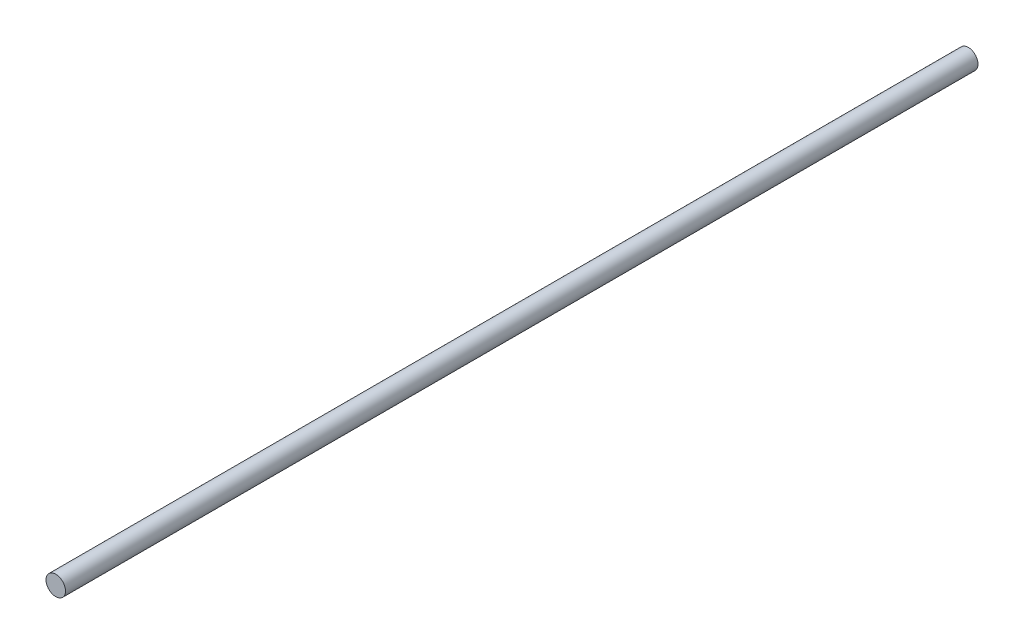
ISO-10303-21;
HEADER;
FILE_DESCRIPTION(('STEP AP214'),'2;1');
FILE_NAME('part.step','',(''),(''),'','','');
FILE_SCHEMA(('AUTOMOTIVE_DESIGN { 1 0 10303 214 1 1 1 1 }'));
ENDSEC;
DATA;
#1=APPLICATION_CONTEXT('core data for automotive mechanical design processes');
#2=APPLICATION_PROTOCOL_DEFINITION('international standard','automotive_design',2000,#1);
#3=PRODUCT_CONTEXT('',#1,'mechanical');
#4=PRODUCT('Part','Part','',(#3));
#5=PRODUCT_RELATED_PRODUCT_CATEGORY('part','',(#4));
#6=PRODUCT_DEFINITION_FORMATION('','',#4);
#7=PRODUCT_DEFINITION_CONTEXT('part definition',#1,'design');
#8=PRODUCT_DEFINITION('design','',#6,#7);
#9=PRODUCT_DEFINITION_SHAPE('','',#8);
#10=(LENGTH_UNIT() NAMED_UNIT(*) SI_UNIT(.MILLI.,.METRE.));
#11=(NAMED_UNIT(*) PLANE_ANGLE_UNIT() SI_UNIT($,.RADIAN.));
#12=(NAMED_UNIT(*) SI_UNIT($,.STERADIAN.) SOLID_ANGLE_UNIT());
#13=UNCERTAINTY_MEASURE_WITH_UNIT(LENGTH_MEASURE(1.E-05),#10,'distance_accuracy_value','');
#14=(GEOMETRIC_REPRESENTATION_CONTEXT(3) GLOBAL_UNCERTAINTY_ASSIGNED_CONTEXT((#13)) GLOBAL_UNIT_ASSIGNED_CONTEXT((#10,
#11,#12)) REPRESENTATION_CONTEXT('',''));
#15=CARTESIAN_POINT('',(0.,0.,0.));
#16=DIRECTION('',(0.,0.,1.));
#17=DIRECTION('',(1.,0.,0.));
#18=AXIS2_PLACEMENT_3D('',#15,#16,#17);
#19=CARTESIAN_POINT('',(0.,0.,374.65));
#20=DIRECTION('',(0.,0.,-1.));
#21=DIRECTION('',(-1.,0.,0.));
#22=AXIS2_PLACEMENT_3D('',#19,#20,#21);
#23=CYLINDRICAL_SURFACE('',#22,4.);
#24=CARTESIAN_POINT('',(0.,0.,374.65));
#25=DIRECTION('',(0.,0.,1.));
#26=DIRECTION('',(1.,0.,0.));
#27=AXIS2_PLACEMENT_3D('',#24,#25,#26);
#28=CIRCLE('',#27,4.);
#29=CARTESIAN_POINT('',(-4.,0.,374.65));
#30=VERTEX_POINT('',#29);
#31=EDGE_CURVE('E10',#30,#30,#28,.T.);
#32=CARTESIAN_POINT('',(0.,0.,0.));
#33=DIRECTION('',(0.,0.,1.));
#34=DIRECTION('',(1.,0.,0.));
#35=AXIS2_PLACEMENT_3D('',#32,#33,#34);
#36=CIRCLE('',#35,4.);
#37=CARTESIAN_POINT('',(-4.,0.,0.));
#38=VERTEX_POINT('',#37);
#39=EDGE_CURVE('E46',#38,#38,#36,.T.);
#40=CARTESIAN_POINT('',(-4.,0.,374.65));
#41=CARTESIAN_POINT('',(-4.,0.,370.747395833333));
#42=CARTESIAN_POINT('',(-4.,0.,366.844791666667));
#43=CARTESIAN_POINT('',(-4.,0.,359.039583333333));
#44=CARTESIAN_POINT('',(-4.,0.,355.136979166667));
#45=CARTESIAN_POINT('',(-4.,0.,347.331770833333));
#46=CARTESIAN_POINT('',(-4.,0.,343.429166666667));
#47=CARTESIAN_POINT('',(-4.,0.,335.623958333333));
#48=CARTESIAN_POINT('',(-4.,0.,331.721354166667));
#49=CARTESIAN_POINT('',(-4.,0.,323.916145833333));
#50=CARTESIAN_POINT('',(-4.,0.,320.013541666667));
#51=CARTESIAN_POINT('',(-4.,0.,312.208333333333));
#52=CARTESIAN_POINT('',(-4.,0.,308.305729166667));
#53=CARTESIAN_POINT('',(-4.,0.,300.500520833333));
#54=CARTESIAN_POINT('',(-4.,0.,296.597916666667));
#55=CARTESIAN_POINT('',(-4.,0.,288.792708333333));
#56=CARTESIAN_POINT('',(-4.,0.,284.890104166667));
#57=CARTESIAN_POINT('',(-4.,0.,277.084895833333));
#58=CARTESIAN_POINT('',(-4.,0.,273.182291666667));
#59=CARTESIAN_POINT('',(-4.,0.,265.377083333333));
#60=CARTESIAN_POINT('',(-4.,0.,261.474479166667));
#61=CARTESIAN_POINT('',(-4.,0.,253.669270833333));
#62=CARTESIAN_POINT('',(-4.,0.,249.766666666667));
#63=CARTESIAN_POINT('',(-4.,0.,241.961458333333));
#64=CARTESIAN_POINT('',(-4.,0.,238.058854166667));
#65=CARTESIAN_POINT('',(-4.,0.,230.253645833333));
#66=CARTESIAN_POINT('',(-4.,0.,226.351041666667));
#67=CARTESIAN_POINT('',(-4.,0.,218.545833333333));
#68=CARTESIAN_POINT('',(-4.,0.,214.643229166667));
#69=CARTESIAN_POINT('',(-4.,0.,206.838020833333));
#70=CARTESIAN_POINT('',(-4.,0.,202.935416666667));
#71=CARTESIAN_POINT('',(-4.,0.,195.130208333333));
#72=CARTESIAN_POINT('',(-4.,0.,191.227604166667));
#73=CARTESIAN_POINT('',(-4.,0.,183.422395833333));
#74=CARTESIAN_POINT('',(-4.,0.,179.519791666667));
#75=CARTESIAN_POINT('',(-4.,0.,171.714583333333));
#76=CARTESIAN_POINT('',(-4.,0.,167.811979166667));
#77=CARTESIAN_POINT('',(-4.,0.,160.006770833333));
#78=CARTESIAN_POINT('',(-4.,0.,156.104166666667));
#79=CARTESIAN_POINT('',(-4.,0.,148.298958333333));
#80=CARTESIAN_POINT('',(-4.,0.,144.396354166667));
#81=CARTESIAN_POINT('',(-4.,0.,136.591145833333));
#82=CARTESIAN_POINT('',(-4.,0.,132.688541666667));
#83=CARTESIAN_POINT('',(-4.,0.,124.883333333333));
#84=CARTESIAN_POINT('',(-4.,0.,120.980729166667));
#85=CARTESIAN_POINT('',(-4.,0.,113.175520833333));
#86=CARTESIAN_POINT('',(-4.,0.,109.272916666667));
#87=CARTESIAN_POINT('',(-4.,0.,101.467708333333));
#88=CARTESIAN_POINT('',(-4.,0.,97.5651041666667));
#89=CARTESIAN_POINT('',(-4.,0.,89.7598958333333));
#90=CARTESIAN_POINT('',(-4.,0.,85.8572916666667));
#91=CARTESIAN_POINT('',(-4.,0.,78.0520833333333));
#92=CARTESIAN_POINT('',(-4.,0.,74.1494791666667));
#93=CARTESIAN_POINT('',(-4.,0.,66.3442708333333));
#94=CARTESIAN_POINT('',(-4.,0.,62.4416666666667));
#95=CARTESIAN_POINT('',(-4.,0.,54.6364583333333));
#96=CARTESIAN_POINT('',(-4.,0.,50.7338541666667));
#97=CARTESIAN_POINT('',(-4.,0.,42.9286458333333));
#98=CARTESIAN_POINT('',(-4.,0.,39.0260416666667));
#99=CARTESIAN_POINT('',(-4.,0.,31.2208333333333));
#100=CARTESIAN_POINT('',(-4.,0.,27.3182291666667));
#101=CARTESIAN_POINT('',(-4.,0.,19.5130208333333));
#102=CARTESIAN_POINT('',(-4.,0.,15.6104166666667));
#103=CARTESIAN_POINT('',(-4.,0.,7.80520833333335));
#104=CARTESIAN_POINT('',(-4.,0.,3.90260416666668));
#105=CARTESIAN_POINT('',(-4.,0.,0.));
#106=B_SPLINE_CURVE_WITH_KNOTS('',3,(#40,#41,#42,#43,#44,#45,#46,#47,#48,#49,#50,#51,#52,#53,
#54,#55,#56,#57,#58,#59,#60,#61,#62,#63,#64,#65,#66,#67,#68,#69,#70,#71,#72,#73,#74,#75,#76,#77,
#78,#79,#80,#81,#82,#83,#84,#85,#86,#87,#88,#89,#90,#91,#92,#93,#94,#95,#96,#97,#98,#99,#100,
#101,#102,#103,#104,#105),.UNSPECIFIED.,.F.,.F.,(4,2,2,2,2,2,2,2,2,2,2,2,2,2,2,2,2,2,2,2,2,2,2,
2,2,2,2,2,2,2,2,2,4),(0.,11.7078125,23.4156250000001,35.1234375,46.83125,58.5390625,70.246875,
81.9546875,93.6625,105.3703125,117.078125,128.7859375,140.49375,152.2015625,163.909375,
175.6171875,187.325,199.0328125,210.740625,222.4484375,234.15625,245.8640625,257.571875,
269.2796875,280.9875,292.6953125,304.403125,316.1109375,327.81875,339.5265625,351.234375,
362.9421875,374.65),.UNSPECIFIED.);
#107=EDGE_CURVE('BSEAM43',#30,#38,#106,.T.);
#108=ORIENTED_EDGE('',*,*,#31,.F.);
#109=ORIENTED_EDGE('',*,*,#39,.T.);
#110=ORIENTED_EDGE('',*,*,#107,.T.);
#111=ORIENTED_EDGE('',*,*,#107,.F.);
#112=EDGE_LOOP('',(#108,#110,#109,#111));
#113=FACE_BOUND('',#112,.T.);
#114=ADVANCED_FACE('F43',(#113),#23,.T.);
#115=CARTESIAN_POINT('',(0.,0.,374.65));
#116=DIRECTION('',(0.,0.,1.));
#117=DIRECTION('',(1.,0.,0.));
#118=AXIS2_PLACEMENT_3D('',#115,#116,#117);
#119=PLANE('',#118);
#120=ORIENTED_EDGE('',*,*,#31,.T.);
#121=EDGE_LOOP('',(#120));
#122=FACE_BOUND('',#121,.T.);
#123=ADVANCED_FACE('F60',(#122),#119,.T.);
#124=CARTESIAN_POINT('',(0.,0.,0.));
#125=DIRECTION('',(0.,0.,1.));
#126=DIRECTION('',(1.,0.,0.));
#127=AXIS2_PLACEMENT_3D('',#124,#125,#126);
#128=PLANE('',#127);
#129=ORIENTED_EDGE('',*,*,#39,.F.);
#130=EDGE_LOOP('',(#129));
#131=FACE_BOUND('',#130,.T.);
#132=ADVANCED_FACE('F58',(#131),#128,.F.);
#133=CLOSED_SHELL('',(#114,#123,#132));
#134=MANIFOLD_SOLID_BREP('B2',#133);
#135=ADVANCED_BREP_SHAPE_REPRESENTATION('',(#18,#134),#14);
#136=SHAPE_DEFINITION_REPRESENTATION(#9,#135);
ENDSEC;
END-ISO-10303-21;
